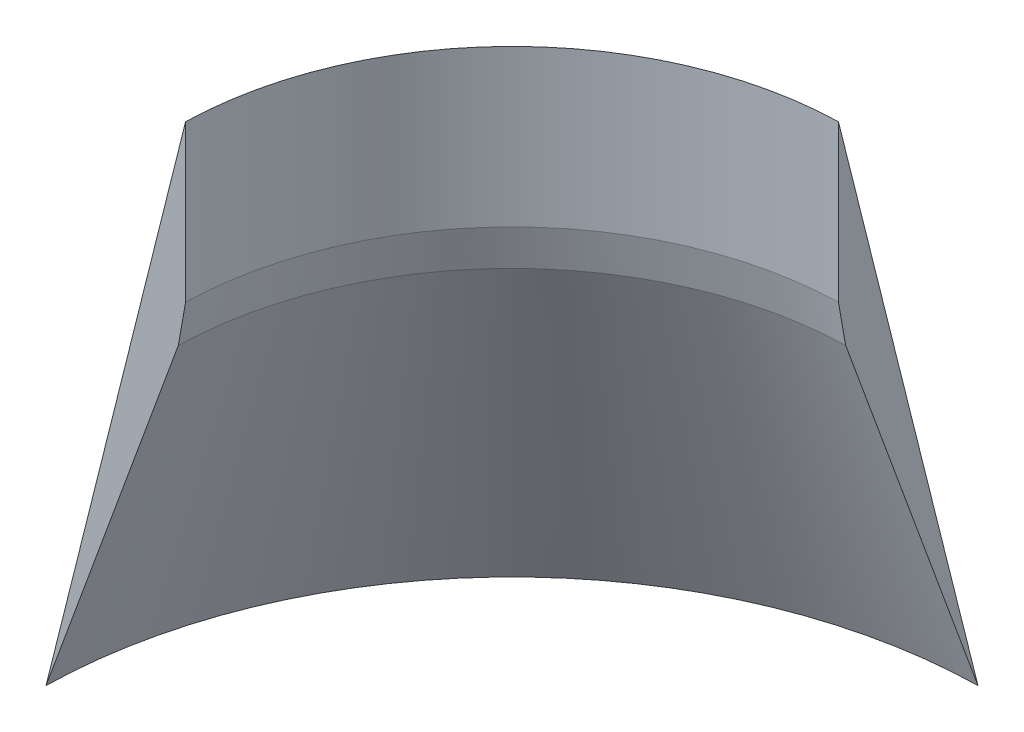
ISO-10303-21;
HEADER;
FILE_DESCRIPTION(('STEP AP214'),'2;1');
FILE_NAME('part.step','',(''),(''),'','','');
FILE_SCHEMA(('AUTOMOTIVE_DESIGN { 1 0 10303 214 1 1 1 1 }'));
ENDSEC;
DATA;
#1=APPLICATION_CONTEXT('core data for automotive mechanical design processes');
#2=APPLICATION_PROTOCOL_DEFINITION('international standard','automotive_design',2000,#1);
#3=PRODUCT_CONTEXT('',#1,'mechanical');
#4=PRODUCT('Part','Part','',(#3));
#5=PRODUCT_RELATED_PRODUCT_CATEGORY('part','',(#4));
#6=PRODUCT_DEFINITION_FORMATION('','',#4);
#7=PRODUCT_DEFINITION_CONTEXT('part definition',#1,'design');
#8=PRODUCT_DEFINITION('design','',#6,#7);
#9=PRODUCT_DEFINITION_SHAPE('','',#8);
#10=(LENGTH_UNIT() NAMED_UNIT(*) SI_UNIT(.MILLI.,.METRE.));
#11=(NAMED_UNIT(*) PLANE_ANGLE_UNIT() SI_UNIT($,.RADIAN.));
#12=(NAMED_UNIT(*) SI_UNIT($,.STERADIAN.) SOLID_ANGLE_UNIT());
#13=UNCERTAINTY_MEASURE_WITH_UNIT(LENGTH_MEASURE(1.E-05),#10,'distance_accuracy_value','');
#14=(GEOMETRIC_REPRESENTATION_CONTEXT(3) GLOBAL_UNCERTAINTY_ASSIGNED_CONTEXT((#13)) GLOBAL_UNIT_ASSIGNED_CONTEXT((#10,
#11,#12)) REPRESENTATION_CONTEXT('',''));
#15=CARTESIAN_POINT('',(0.,0.,0.));
#16=DIRECTION('',(0.,0.,1.));
#17=DIRECTION('',(1.,0.,0.));
#18=AXIS2_PLACEMENT_3D('',#15,#16,#17);
#19=CARTESIAN_POINT('',(0.,-152.980302752278,0.));
#20=DIRECTION('',(0.,-1.,0.));
#21=DIRECTION('',(0.,0.,-1.));
#22=AXIS2_PLACEMENT_3D('',#19,#20,#21);
#23=CONICAL_SURFACE('',#22,85.,0.244978663126864);
#24=CARTESIAN_POINT('',(0.,-152.980302752278,0.));
#25=DIRECTION('',(0.,1.,0.));
#26=DIRECTION('',(0.,0.,1.));
#27=AXIS2_PLACEMENT_3D('',#24,#25,#26);
#28=CIRCLE('',#27,85.);
#29=CARTESIAN_POINT('',(-1.5,-152.980302752278,-84.9867636752924));
#30=VERTEX_POINT('',#29);
#31=CARTESIAN_POINT('',(-84.9867636752924,-152.980302752278,-1.5));
#32=VERTEX_POINT('',#31);
#33=EDGE_CURVE('E97',#30,#32,#28,.T.);
#34=ORIENTED_EDGE('',*,*,#33,.T.);
#35=CARTESIAN_POINT('',(-117.562087539669,-283.266928999461,-1.5));
#36=CARTESIAN_POINT('',(-113.736910237577,-267.967473470545,-1.5));
#37=CARTESIAN_POINT('',(-109.911708040792,-252.668024165643,-1.5));
#38=CARTESIAN_POINT('',(-102.261224884222,-222.069145256676,-1.5));
#39=CARTESIAN_POINT('',(-98.4359439244375,-206.769715652611,-1.5));
#40=CARTESIAN_POINT('',(-90.7852742751086,-176.170883425538,-1.5));
#41=CARTESIAN_POINT('',(-86.959885585565,-160.871480802531,-1.5));
#42=CARTESIAN_POINT('',(-79.3089496375234,-130.27271519647,-1.5));
#43=CARTESIAN_POINT('',(-75.4834023790253,-114.973352213415,-1.5));
#44=CARTESIAN_POINT('',(-67.9698606040387,-84.9257677943472,-1.5));
#45=CARTESIAN_POINT('',(-64.2818748370679,-70.1775441704826,-1.5));
#46=CARTESIAN_POINT('',(-56.9055304876703,-40.6811901709225,-1.5));
#47=CARTESIAN_POINT('',(-53.217171905244,-25.9330597952268,-1.5));
#48=CARTESIAN_POINT('',(-47.6841178119899,-3.81099330617629,-1.5));
#49=CARTESIAN_POINT('',(-45.8396804065442,3.56300736211418,-1.5));
#50=CARTESIAN_POINT('',(-42.1505528251891,18.310945463087,-1.5));
#51=CARTESIAN_POINT('',(-40.3058626492799,25.6848828957694,-1.5));
#52=CARTESIAN_POINT('',(-36.6161198656801,40.4326671253411,-1.5));
#53=CARTESIAN_POINT('',(-34.771067257988,47.8065139222301,-1.5));
#54=CARTESIAN_POINT('',(-31.0803396896004,62.5540517840435,-1.5));
#55=CARTESIAN_POINT('',(-29.2346647289031,69.9277428489675,-1.5));
#56=CARTESIAN_POINT('',(-27.3885486323242,77.301323494904,-1.5));
#57=B_SPLINE_CURVE_WITH_KNOTS('',3,(#35,#36,#37,#38,#39,#40,#41,#42,#43,#44,#45,#46,#47,#48,#49,
#50,#51,#52,#53,#54,#55,#56),.UNSPECIFIED.,.F.,.F.,(4,2,2,2,2,2,2,2,2,2,4),(0.,47.3111814255946,
94.6223628276293,141.933544097778,189.244725392348,234.851764887499,280.458804328129,
303.26232415785,326.065843969381,348.869363880588,371.672883856846),.UNSPECIFIED.);
#58=CARTESIAN_POINT('',(-59.9812470693966,-52.9803027522782,-1.5));
#59=VERTEX_POINT('',#58);
#60=EDGE_CURVE('E11',#32,#59,#57,.T.);
#61=ORIENTED_EDGE('',*,*,#60,.T.);
#62=CARTESIAN_POINT('',(0.,-52.9803027522782,0.));
#63=DIRECTION('',(0.,1.,0.));
#64=DIRECTION('',(0.,0.,1.));
#65=AXIS2_PLACEMENT_3D('',#62,#63,#64);
#66=CIRCLE('',#65,60.);
#67=CARTESIAN_POINT('',(-1.5,-52.9803027522782,-59.9812470693966));
#68=VERTEX_POINT('',#67);
#69=EDGE_CURVE('E94',#68,#59,#66,.T.);
#70=ORIENTED_EDGE('',*,*,#69,.F.);
#71=CARTESIAN_POINT('',(-1.50000000000001,77.3013234949041,-27.3885486323242));
#72=CARTESIAN_POINT('',(-1.50000000000001,70.163151659013,-29.1757305599118));
#73=CARTESIAN_POINT('',(-1.50000000000001,63.0248747715839,-30.9624927957937));
#74=CARTESIAN_POINT('',(-1.50000000000001,48.7481729065514,-34.535425431103));
#75=CARTESIAN_POINT('',(-1.50000000000001,41.6097479289487,-36.3215958305325));
#76=CARTESIAN_POINT('',(-1.50000000000001,20.1943438369465,-41.6795906054117));
#77=CARTESIAN_POINT('',(-1.5,5.91723552666854,-45.2508985666342));
#78=CARTESIAN_POINT('',(-1.5,-22.6371465981672,-52.3928527974314));
#79=CARTESIAN_POINT('',(-1.5,-36.9144204127251,-55.9634990670054));
#80=CARTESIAN_POINT('',(-1.5,-79.7463770784317,-66.6748979444124));
#81=CARTESIAN_POINT('',(-1.5,-108.301194965296,-73.8151105743261));
#82=CARTESIAN_POINT('',(-1.5,-161.257814346577,-87.056522544679));
#83=CARTESIAN_POINT('',(-1.5,-185.659597364568,-93.1577957825117));
#84=CARTESIAN_POINT('',(-1.5,-234.463225737208,-105.360091928358));
#85=CARTESIAN_POINT('',(-1.5,-258.865071091858,-111.461114836375));
#86=CARTESIAN_POINT('',(-1.5,-283.266928999461,-117.562087539669));
#87=B_SPLINE_CURVE_WITH_KNOTS('',3,(#71,#72,#73,#74,#75,#76,#77,#78,#79,#80,#81,#82,#83,#84,#85,
#86),.UNSPECIFIED.,.F.,.F.,(4,2,2,2,2,2,2,4),(0.,22.0754987584059,44.1509974343735,
88.3019946728593,132.45299195198,220.754987086393,296.21393583546,371.672883847634),.UNSPECIFIED.);
#88=EDGE_CURVE('E51',#68,#30,#87,.T.);
#89=ORIENTED_EDGE('',*,*,#88,.T.);
#90=EDGE_LOOP('',(#34,#61,#70,#89));
#91=FACE_BOUND('',#90,.T.);
#92=ADVANCED_FACE('F41',(#91),#23,.T.);
#93=CARTESIAN_POINT('',(0.,0.,0.));
#94=DIRECTION('',(0.,1.,0.));
#95=DIRECTION('',(0.,0.,1.));
#96=AXIS2_PLACEMENT_3D('',#93,#94,#95);
#97=CYLINDRICAL_SURFACE('',#96,60.0000000000003);
#98=ORIENTED_EDGE('',*,*,#69,.T.);
#99=DIRECTION('',(0.,1.,0.));
#100=VECTOR('',#99,1.);
#101=CARTESIAN_POINT('',(-59.9812470693969,0.,-1.5));
#102=LINE('',#101,#100);
#103=CARTESIAN_POINT('',(-59.9812470693969,-80.9803027522783,-1.5));
#104=VERTEX_POINT('',#103);
#105=EDGE_CURVE('E59',#59,#104,#102,.F.);
#106=ORIENTED_EDGE('',*,*,#105,.T.);
#107=CARTESIAN_POINT('',(0.,-80.9803027522783,0.));
#108=DIRECTION('',(0.,1.,0.));
#109=DIRECTION('',(0.,0.,1.));
#110=AXIS2_PLACEMENT_3D('',#107,#108,#109);
#111=CIRCLE('',#110,60.0000000000006);
#112=CARTESIAN_POINT('',(-1.5,-80.9803027522783,-59.9812470693969));
#113=VERTEX_POINT('',#112);
#114=EDGE_CURVE('E89',#113,#104,#111,.T.);
#115=ORIENTED_EDGE('',*,*,#114,.F.);
#116=DIRECTION('',(0.,1.,0.));
#117=VECTOR('',#116,1.);
#118=CARTESIAN_POINT('',(-1.5,0.,-59.9812470693969));
#119=LINE('',#118,#117);
#120=EDGE_CURVE('E83',#113,#68,#119,.T.);
#121=ORIENTED_EDGE('',*,*,#120,.T.);
#122=EDGE_LOOP('',(#98,#106,#115,#121));
#123=FACE_BOUND('',#122,.T.);
#124=ADVANCED_FACE('F43',(#123),#97,.F.);
#125=CARTESIAN_POINT('',(0.,-88.3355738979252,0.));
#126=DIRECTION('',(0.,-1.,0.));
#127=DIRECTION('',(0.,0.,-1.));
#128=AXIS2_PLACEMENT_3D('',#125,#126,#127);
#129=CONICAL_SURFACE('',#128,61.2969327534039,0.351444794003552);
#130=CARTESIAN_POINT('',(0.,-88.3355738979252,0.));
#131=DIRECTION('',(0.,1.,0.));
#132=DIRECTION('',(0.,0.,1.));
#133=AXIS2_PLACEMENT_3D('',#130,#131,#132);
#134=CIRCLE('',#133,61.2969327534039);
#135=CARTESIAN_POINT('',(-1.5,-88.3355738979252,-61.2785767211945));
#136=VERTEX_POINT('',#135);
#137=CARTESIAN_POINT('',(-61.2785767211944,-88.3355738979252,-1.5));
#138=VERTEX_POINT('',#137);
#139=EDGE_CURVE('E45',#136,#138,#134,.T.);
#140=ORIENTED_EDGE('',*,*,#139,.T.);
#141=CARTESIAN_POINT('',(-22.5231815340622,17.2749477635797,-1.5));
#142=CARTESIAN_POINT('',(-23.4885218776912,14.6479918512865,-1.5));
#143=CARTESIAN_POINT('',(-24.4536403216498,12.0209544146373,-1.5));
#144=CARTESIAN_POINT('',(-26.3835367542456,6.76675450940516,-1.5));
#145=CARTESIAN_POINT('',(-27.3483147428853,4.13959204082313,-1.5));
#146=CARTESIAN_POINT('',(-30.2422930331718,-3.74202586398783,-1.5));
#147=CARTESIAN_POINT('',(-32.1711376889587,-8.99661188032074,-1.5));
#148=CARTESIAN_POINT('',(-37.9568880377616,-24.760657222131,-1.5));
#149=CARTESIAN_POINT('',(-41.8130102060586,-35.2704040959393,-1.5));
#150=CARTESIAN_POINT('',(-49.5244048591078,-56.2902095609195,-1.5));
#151=CARTESIAN_POINT('',(-53.3796773438572,-66.8002681520923,-1.5));
#152=CARTESIAN_POINT('',(-61.0897636755857,-87.8205539160423,-1.5));
#153=CARTESIAN_POINT('',(-64.9445775225509,-98.3307810888246,-1.5));
#154=CARTESIAN_POINT('',(-72.6539419567556,-119.351331963076,-1.5));
#155=CARTESIAN_POINT('',(-76.5084925439953,-129.861655664546,-1.5));
#156=CARTESIAN_POINT('',(-87.5886526413397,-160.075002386561,-1.5));
#157=CARTESIAN_POINT('',(-94.8140564714186,-179.778100836209,-1.5));
#158=CARTESIAN_POINT('',(-105.651955616417,-209.332823803577,-1.5));
#159=CARTESIAN_POINT('',(-109.264554155973,-219.18441046916,-1.5));
#160=CARTESIAN_POINT('',(-116.489696748552,-238.887603773757,-1.5));
#161=CARTESIAN_POINT('',(-120.102240801576,-248.739210412771,-1.5));
#162=CARTESIAN_POINT('',(-123.714764778456,-258.590824413783,-1.5));
#163=B_SPLINE_CURVE_WITH_KNOTS('',3,(#141,#142,#143,#144,#145,#146,#147,#148,#149,#150,#151,
#152,#153,#154,#155,#156,#157,#158,#159,#160,#161,#162),.UNSPECIFIED.,.F.,.F.,(4,2,2,2,2,2,2,2,
2,2,4),(0.,8.39613086588648,16.7922616706475,33.5845230211643,67.1690449055809,100.753566897401,
134.338089888702,167.922612823839,230.881066905954,262.360292632516,293.839518340085),.UNSPECIFIED.);
#164=EDGE_CURVE('E102',#138,#32,#163,.T.);
#165=ORIENTED_EDGE('',*,*,#164,.T.);
#166=ORIENTED_EDGE('',*,*,#33,.F.);
#167=CARTESIAN_POINT('',(-1.5,-258.590824413783,-123.714764778456));
#168=CARTESIAN_POINT('',(-1.5,-244.188745438257,-118.433606948757));
#169=CARTESIAN_POINT('',(-1.5,-229.786678129153,-113.152417301195));
#170=CARTESIAN_POINT('',(-1.5,-200.982593050641,-102.589902904866));
#171=CARTESIAN_POINT('',(-1.5,-186.580575281234,-97.3085781560978));
#172=CARTESIAN_POINT('',(-1.5,-157.776615734768,-86.7457221820083));
#173=CARTESIAN_POINT('',(-1.5,-143.374673957708,-81.4641909566906));
#174=CARTESIAN_POINT('',(-1.5,-114.570920545066,-70.900773522468));
#175=CARTESIAN_POINT('',(-1.5,-100.169108909484,-65.6188873135623));
#176=CARTESIAN_POINT('',(-1.5,-77.1800386640029,-57.1869528725136));
#177=CARTESIAN_POINT('',(-1.5,-68.5926941535084,-54.037138843749));
#178=CARTESIAN_POINT('',(-1.5,-51.418162904689,-47.7370808068395));
#179=CARTESIAN_POINT('',(-1.5,-42.8309761663632,-44.5868367986967));
#180=CARTESIAN_POINT('',(-1.50000000000001,-29.9504169991243,-39.8608683493649));
#181=CARTESIAN_POINT('',(-1.50000000000001,-25.6569340586244,-38.2854451115176));
#182=CARTESIAN_POINT('',(-1.50000000000001,-17.0700762643236,-35.1343041398775));
#183=CARTESIAN_POINT('',(-1.50000000000001,-12.7767014105225,-33.5585864060856));
#184=CARTESIAN_POINT('',(-1.50000000000001,-4.19011290888218,-30.4067114913923));
#185=CARTESIAN_POINT('',(-1.50000000000001,0.103100738953938,-28.8305543104827));
#186=CARTESIAN_POINT('',(-1.50000000000001,6.54272520122327,-26.4657846837813));
#187=CARTESIAN_POINT('',(-1.50000000000001,8.68923403272819,-25.677439161128));
#188=CARTESIAN_POINT('',(-1.50000000000001,12.9821631313514,-24.1005069871974));
#189=CARTESIAN_POINT('',(-1.50000000000001,15.1285833984692,-23.3119203359189));
#190=CARTESIAN_POINT('',(-1.50000000000001,17.2749477635797,-22.5231815340623));
#191=B_SPLINE_CURVE_WITH_KNOTS('',3,(#167,#168,#169,#170,#171,#172,#173,#174,#175,#176,#177,
#178,#179,#180,#181,#182,#183,#184,#185,#186,#187,#188,#189,#190),.UNSPECIFIED.,.F.,.F.,(4,2,2,
2,2,2,2,2,2,2,2,4),(0.,46.0195019714123,92.0390039493217,138.058505154812,184.078006473447,
211.518384152752,238.958761684345,252.678950715139,266.399139699143,280.119328937962,
286.979423636182,293.839518366293),.UNSPECIFIED.);
#192=EDGE_CURVE('E66',#30,#136,#191,.T.);
#193=ORIENTED_EDGE('',*,*,#192,.T.);
#194=EDGE_LOOP('',(#140,#165,#166,#193));
#195=FACE_BOUND('',#194,.T.);
#196=ADVANCED_FACE('F146',(#195),#129,.F.);
#197=CARTESIAN_POINT('',(0.,-80.9803027522783,0.));
#198=DIRECTION('',(0.,-1.,0.));
#199=DIRECTION('',(0.,0.,-1.));
#200=AXIS2_PLACEMENT_3D('',#197,#198,#199);
#201=CONICAL_SURFACE('',#200,60.0000000000006,0.174532925199328);
#202=ORIENTED_EDGE('',*,*,#114,.T.);
#203=CARTESIAN_POINT('',(-49.3527962948195,-20.7262573225834,-1.5));
#204=CARTESIAN_POINT('',(-51.7890154511286,-34.536411741985,-1.5));
#205=CARTESIAN_POINT('',(-54.2250897493875,-48.3465917141488,-1.5));
#206=CARTESIAN_POINT('',(-59.0970213419806,-75.9669899340233,-1.5));
#207=CARTESIAN_POINT('',(-61.5328786363148,-89.7772081817341,-1.5));
#208=CARTESIAN_POINT('',(-65.2915422463948,-111.087795705609,-1.5));
#209=CARTESIAN_POINT('',(-66.6143994277175,-118.588156010506,-1.5));
#210=CARTESIAN_POINT('',(-69.26007714978,-133.588883083101,-1.5));
#211=CARTESIAN_POINT('',(-70.5828976905197,-141.089249850801,-1.5));
#212=CARTESIAN_POINT('',(-71.9057028705927,-148.58961932762,-1.5));
#213=B_SPLINE_CURVE_WITH_KNOTS('',3,(#203,#204,#205,#206,#207,#208,#209,#210,#211,#212),
.UNSPECIFIED.,.F.,.F.,(4,2,2,2,4),(0.,42.0701766049153,84.1403532047121,106.988727379421,
129.837101555603),.UNSPECIFIED.);
#214=EDGE_CURVE('E98',#104,#138,#213,.T.);
#215=ORIENTED_EDGE('',*,*,#214,.T.);
#216=ORIENTED_EDGE('',*,*,#139,.F.);
#217=CARTESIAN_POINT('',(-1.5,-148.58961932762,-71.9057028705927));
#218=CARTESIAN_POINT('',(-1.5,-137.934307390975,-70.0264741098494));
#219=CARTESIAN_POINT('',(-1.5,-127.279000586063,-68.1472162512086));
#220=CARTESIAN_POINT('',(-1.5,-105.968401084661,-64.3886205481046));
#221=CARTESIAN_POINT('',(-1.5,-95.3131083881709,-62.5092827036414));
#222=CARTESIAN_POINT('',(-1.5,-74.0025409458374,-58.7505052383821));
#223=CARTESIAN_POINT('',(-1.5,-63.3472661999937,-56.871065617586));
#224=CARTESIAN_POINT('',(-1.5,-42.0367414784209,-53.1120459440202));
#225=CARTESIAN_POINT('',(-1.5,-31.3814915026919,-51.2324658912504));
#226=CARTESIAN_POINT('',(-1.5,-20.7262573225834,-49.3527962948195));
#227=B_SPLINE_CURVE_WITH_KNOTS('',3,(#217,#218,#219,#220,#221,#222,#223,#224,#225,#226),
.UNSPECIFIED.,.F.,.F.,(4,2,2,2,4),(0.,32.4592753897928,64.9185507762613,97.3778261644111,
129.837101555927),.UNSPECIFIED.);
#228=EDGE_CURVE('E140',#136,#113,#227,.T.);
#229=ORIENTED_EDGE('',*,*,#228,.T.);
#230=EDGE_LOOP('',(#202,#215,#216,#229));
#231=FACE_BOUND('',#230,.T.);
#232=ADVANCED_FACE('F130',(#231),#201,.F.);
#233=CARTESIAN_POINT('',(-1.5,-52.9803027522782,-85.));
#234=DIRECTION('',(-1.,0.,0.));
#235=DIRECTION('',(0.,0.,1.));
#236=AXIS2_PLACEMENT_3D('',#233,#234,#235);
#237=PLANE('',#236);
#238=ORIENTED_EDGE('',*,*,#192,.F.);
#239=ORIENTED_EDGE('',*,*,#88,.F.);
#240=ORIENTED_EDGE('',*,*,#120,.F.);
#241=ORIENTED_EDGE('',*,*,#228,.F.);
#242=EDGE_LOOP('',(#238,#239,#240,#241));
#243=FACE_BOUND('',#242,.T.);
#244=ADVANCED_FACE('F82',(#243),#237,.F.);
#245=CARTESIAN_POINT('',(-85.,-52.9803027522782,-1.5));
#246=DIRECTION('',(0.,0.,-1.));
#247=DIRECTION('',(-1.,0.,0.));
#248=AXIS2_PLACEMENT_3D('',#245,#246,#247);
#249=PLANE('',#248);
#250=ORIENTED_EDGE('',*,*,#105,.F.);
#251=ORIENTED_EDGE('',*,*,#60,.F.);
#252=ORIENTED_EDGE('',*,*,#164,.F.);
#253=ORIENTED_EDGE('',*,*,#214,.F.);
#254=EDGE_LOOP('',(#250,#251,#252,#253));
#255=FACE_BOUND('',#254,.T.);
#256=ADVANCED_FACE('F129',(#255),#249,.F.);
#257=CLOSED_SHELL('',(#92,#124,#196,#232,#244,#256));
#258=MANIFOLD_SOLID_BREP('B2',#257);
#259=ADVANCED_BREP_SHAPE_REPRESENTATION('',(#18,#258),#14);
#260=SHAPE_DEFINITION_REPRESENTATION(#9,#259);
ENDSEC;
END-ISO-10303-21;
